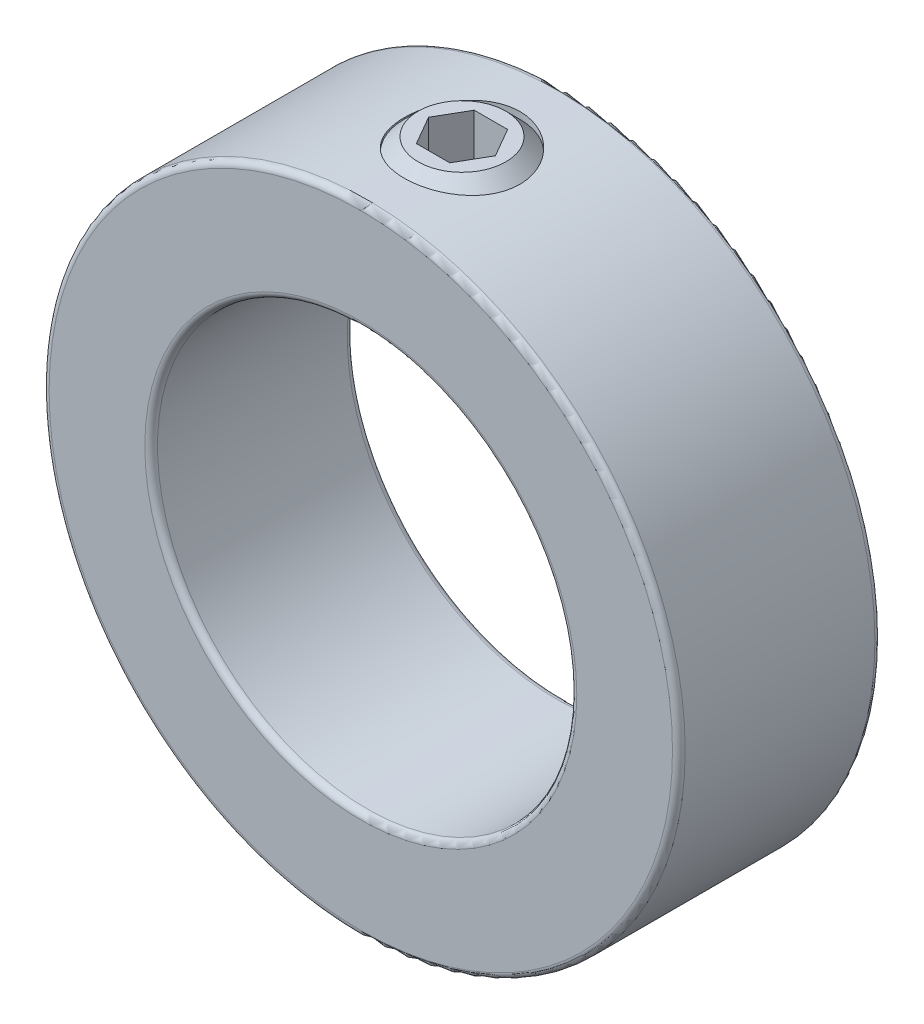
ISO-10303-21;
HEADER;
FILE_DESCRIPTION(('STEP AP214'),'2;1');
FILE_NAME('part.step','',(''),(''),'','','');
FILE_SCHEMA(('AUTOMOTIVE_DESIGN { 1 0 10303 214 1 1 1 1 }'));
ENDSEC;
DATA;
#1=APPLICATION_CONTEXT('core data for automotive mechanical design processes');
#2=APPLICATION_PROTOCOL_DEFINITION('international standard','automotive_design',2000,#1);
#3=PRODUCT_CONTEXT('',#1,'mechanical');
#4=PRODUCT('Part','Part','',(#3));
#5=PRODUCT_RELATED_PRODUCT_CATEGORY('part','',(#4));
#6=PRODUCT_DEFINITION_FORMATION('','',#4);
#7=PRODUCT_DEFINITION_CONTEXT('part definition',#1,'design');
#8=PRODUCT_DEFINITION('design','',#6,#7);
#9=PRODUCT_DEFINITION_SHAPE('','',#8);
#10=(LENGTH_UNIT() NAMED_UNIT(*) SI_UNIT(.MILLI.,.METRE.));
#11=(NAMED_UNIT(*) PLANE_ANGLE_UNIT() SI_UNIT($,.RADIAN.));
#12=(NAMED_UNIT(*) SI_UNIT($,.STERADIAN.) SOLID_ANGLE_UNIT());
#13=UNCERTAINTY_MEASURE_WITH_UNIT(LENGTH_MEASURE(1.E-05),#10,'distance_accuracy_value','');
#14=(GEOMETRIC_REPRESENTATION_CONTEXT(3) GLOBAL_UNCERTAINTY_ASSIGNED_CONTEXT((#13)) GLOBAL_UNIT_ASSIGNED_CONTEXT((#10,
#11,#12)) REPRESENTATION_CONTEXT('',''));
#15=CARTESIAN_POINT('',(0.,0.,0.));
#16=DIRECTION('',(0.,0.,1.));
#17=DIRECTION('',(1.,0.,0.));
#18=AXIS2_PLACEMENT_3D('',#15,#16,#17);
#19=CARTESIAN_POINT('',(0.,35.71875,0.));
#20=DIRECTION('',(0.,1.,0.));
#21=DIRECTION('',(-1.,0.,0.));
#22=AXIS2_PLACEMENT_3D('',#19,#20,#21);
#23=PLANE('',#22);
#24=CARTESIAN_POINT('',(0.,35.71875,0.));
#25=DIRECTION('',(0.,1.,0.));
#26=DIRECTION('',(-1.,0.,0.));
#27=AXIS2_PLACEMENT_3D('',#24,#25,#26);
#28=CIRCLE('',#27,4.81638526248807);
#29=CARTESIAN_POINT('',(-4.81638526248807,35.71875,0.));
#30=VERTEX_POINT('',#29);
#31=EDGE_CURVE('E12',#30,#30,#28,.T.);
#32=ORIENTED_EDGE('',*,*,#31,.T.);
#33=EDGE_LOOP('',(#32));
#34=FACE_BOUND('',#33,.T.);
#35=DIRECTION('',(1.,0.,0.));
#36=VECTOR('',#35,1.);
#37=CARTESIAN_POINT('',(-1.83308710467706,35.71875,-3.175));
#38=LINE('',#37,#36);
#39=CARTESIAN_POINT('',(-1.83308710467706,35.71875,-3.175));
#40=VERTEX_POINT('',#39);
#41=CARTESIAN_POINT('',(1.83308710467706,35.71875,-3.175));
#42=VERTEX_POINT('',#41);
#43=EDGE_CURVE('E115',#40,#42,#38,.T.);
#44=ORIENTED_EDGE('',*,*,#43,.T.);
#45=DIRECTION('',(0.5,0.,0.866025403784438));
#46=VECTOR('',#45,1.);
#47=CARTESIAN_POINT('',(1.83308710467706,35.71875,-3.175));
#48=LINE('',#47,#46);
#49=CARTESIAN_POINT('',(3.66617420935412,35.71875,0.));
#50=VERTEX_POINT('',#49);
#51=EDGE_CURVE('E61',#42,#50,#48,.T.);
#52=ORIENTED_EDGE('',*,*,#51,.T.);
#53=DIRECTION('',(-0.5,0.,0.866025403784439));
#54=VECTOR('',#53,1.);
#55=CARTESIAN_POINT('',(3.66617420935412,35.71875,0.));
#56=LINE('',#55,#54);
#57=CARTESIAN_POINT('',(1.83308710467706,35.71875,3.175));
#58=VERTEX_POINT('',#57);
#59=EDGE_CURVE('E119',#50,#58,#56,.T.);
#60=ORIENTED_EDGE('',*,*,#59,.T.);
#61=DIRECTION('',(-1.,0.,0.));
#62=VECTOR('',#61,1.);
#63=CARTESIAN_POINT('',(1.83308710467706,35.71875,3.175));
#64=LINE('',#63,#62);
#65=CARTESIAN_POINT('',(-1.83308710467706,35.71875,3.175));
#66=VERTEX_POINT('',#65);
#67=EDGE_CURVE('E182',#58,#66,#64,.T.);
#68=ORIENTED_EDGE('',*,*,#67,.T.);
#69=DIRECTION('',(-0.5,0.,-0.866025403784438));
#70=VECTOR('',#69,1.);
#71=CARTESIAN_POINT('',(-1.83308710467706,35.71875,3.175));
#72=LINE('',#71,#70);
#73=CARTESIAN_POINT('',(-3.66617420935412,35.71875,0.));
#74=VERTEX_POINT('',#73);
#75=EDGE_CURVE('E167',#66,#74,#72,.T.);
#76=ORIENTED_EDGE('',*,*,#75,.T.);
#77=DIRECTION('',(0.5,0.,-0.866025403784439));
#78=VECTOR('',#77,1.);
#79=CARTESIAN_POINT('',(-3.66617420935412,35.71875,0.));
#80=LINE('',#79,#78);
#81=EDGE_CURVE('E163',#74,#40,#80,.T.);
#82=ORIENTED_EDGE('',*,*,#81,.T.);
#83=EDGE_LOOP('',(#44,#52,#60,#68,#76,#82));
#84=FACE_BOUND('',#83,.T.);
#85=ADVANCED_FACE('F47',(#34,#84),#23,.T.);
#86=CARTESIAN_POINT('',(0.,35.71875,0.));
#87=DIRECTION('',(0.,-1.,0.));
#88=DIRECTION('',(1.,0.,0.));
#89=AXIS2_PLACEMENT_3D('',#86,#87,#88);
#90=CONICAL_SURFACE('',#89,4.81638526248807,0.785398163397449);
#91=CARTESIAN_POINT('',(0.,34.1851352624881,0.));
#92=DIRECTION('',(0.,1.,0.));
#93=DIRECTION('',(-1.,0.,0.));
#94=AXIS2_PLACEMENT_3D('',#91,#92,#93);
#95=CIRCLE('',#94,6.35);
#96=CARTESIAN_POINT('',(-6.35,34.1851352624881,0.));
#97=VERTEX_POINT('',#96);
#98=EDGE_CURVE('E54',#97,#97,#95,.T.);
#99=ORIENTED_EDGE('',*,*,#98,.T.);
#100=EDGE_LOOP('',(#99));
#101=FACE_BOUND('',#100,.T.);
#102=ORIENTED_EDGE('',*,*,#31,.F.);
#103=EDGE_LOOP('',(#102));
#104=FACE_BOUND('',#103,.T.);
#105=ADVANCED_FACE('F137',(#101,#104),#90,.T.);
#106=CARTESIAN_POINT('',(0.,23.01875,0.));
#107=DIRECTION('',(0.,1.,0.));
#108=DIRECTION('',(-1.,0.,0.));
#109=AXIS2_PLACEMENT_3D('',#106,#107,#108);
#110=CYLINDRICAL_SURFACE('',#109,6.35);
#111=CARTESIAN_POINT('',(0.,24.5523647375119,0.));
#112=DIRECTION('',(0.,1.,0.));
#113=DIRECTION('',(-1.,0.,0.));
#114=AXIS2_PLACEMENT_3D('',#111,#112,#113);
#115=CIRCLE('',#114,6.35);
#116=CARTESIAN_POINT('',(-6.35,24.5523647375119,0.));
#117=VERTEX_POINT('',#116);
#118=EDGE_CURVE('E132',#117,#117,#115,.T.);
#119=ORIENTED_EDGE('',*,*,#118,.T.);
#120=EDGE_LOOP('',(#119));
#121=FACE_BOUND('',#120,.T.);
#122=ORIENTED_EDGE('',*,*,#98,.F.);
#123=EDGE_LOOP('',(#122));
#124=FACE_BOUND('',#123,.T.);
#125=ADVANCED_FACE('F140',(#121,#124),#110,.T.);
#126=CARTESIAN_POINT('',(0.,24.5523647375119,0.));
#127=DIRECTION('',(0.,1.,0.));
#128=DIRECTION('',(-1.,0.,0.));
#129=AXIS2_PLACEMENT_3D('',#126,#127,#128);
#130=CONICAL_SURFACE('',#129,6.35,0.785398163397449);
#131=CARTESIAN_POINT('',(0.,23.01875,0.));
#132=DIRECTION('',(0.,1.,0.));
#133=DIRECTION('',(-1.,0.,0.));
#134=AXIS2_PLACEMENT_3D('',#131,#132,#133);
#135=CIRCLE('',#134,4.81638526248807);
#136=CARTESIAN_POINT('',(-4.81638526248807,23.01875,0.));
#137=VERTEX_POINT('',#136);
#138=EDGE_CURVE('E124',#137,#137,#135,.T.);
#139=ORIENTED_EDGE('',*,*,#138,.T.);
#140=EDGE_LOOP('',(#139));
#141=FACE_BOUND('',#140,.T.);
#142=ORIENTED_EDGE('',*,*,#118,.F.);
#143=EDGE_LOOP('',(#142));
#144=FACE_BOUND('',#143,.T.);
#145=ADVANCED_FACE('F142',(#141,#144),#130,.T.);
#146=CARTESIAN_POINT('',(-4.81638526248807,23.01875,0.));
#147=DIRECTION('',(0.,-1.,0.));
#148=DIRECTION('',(1.,0.,0.));
#149=AXIS2_PLACEMENT_3D('',#146,#147,#148);
#150=PLANE('',#149);
#151=CARTESIAN_POINT('',(0.,23.01875,0.));
#152=DIRECTION('',(0.,1.,0.));
#153=DIRECTION('',(-1.,0.,0.));
#154=AXIS2_PLACEMENT_3D('',#151,#152,#153);
#155=CIRCLE('',#154,1.84033768501432);
#156=CARTESIAN_POINT('',(-1.84033768501432,23.01875,0.));
#157=VERTEX_POINT('',#156);
#158=EDGE_CURVE('E120',#157,#157,#155,.T.);
#159=ORIENTED_EDGE('',*,*,#158,.T.);
#160=EDGE_LOOP('',(#159));
#161=FACE_BOUND('',#160,.T.);
#162=ORIENTED_EDGE('',*,*,#138,.F.);
#163=EDGE_LOOP('',(#162));
#164=FACE_BOUND('',#163,.T.);
#165=ADVANCED_FACE('F149',(#161,#164),#150,.T.);
#166=CARTESIAN_POINT('',(0.,23.01875,0.));
#167=DIRECTION('',(0.,-1.,0.));
#168=DIRECTION('',(1.,0.,0.));
#169=AXIS2_PLACEMENT_3D('',#166,#167,#168);
#170=CONICAL_SURFACE('',#169,1.84033768501432,0.785398163397448);
#171=CARTESIAN_POINT('',(0.,24.8590876850143,0.));
#172=VERTEX_POINT('',#171);
#173=VERTEX_LOOP('',#172);
#174=FACE_BOUND('',#173,.T.);
#175=ORIENTED_EDGE('',*,*,#158,.F.);
#176=EDGE_LOOP('',(#175));
#177=FACE_BOUND('',#176,.T.);
#178=ADVANCED_FACE('F216',(#174,#177),#170,.F.);
#179=CARTESIAN_POINT('',(1.83308710467706,29.36875,-3.175));
#180=DIRECTION('',(-0.866025403784439,0.,0.5));
#181=DIRECTION('',(0.5,0.,0.866025403784439));
#182=AXIS2_PLACEMENT_3D('',#179,#180,#181);
#183=PLANE('',#182);
#184=ORIENTED_EDGE('',*,*,#51,.F.);
#185=DIRECTION('',(0.,1.,0.));
#186=VECTOR('',#185,1.);
#187=CARTESIAN_POINT('',(1.83308710467706,29.36875,-3.175));
#188=LINE('',#187,#186);
#189=CARTESIAN_POINT('',(1.83308710467706,29.36875,-3.175));
#190=VERTEX_POINT('',#189);
#191=EDGE_CURVE('E114',#190,#42,#188,.T.);
#192=ORIENTED_EDGE('',*,*,#191,.F.);
#193=DIRECTION('',(0.5,0.,0.866025403784438));
#194=VECTOR('',#193,1.);
#195=CARTESIAN_POINT('',(1.83308710467706,29.36875,-3.175));
#196=LINE('',#195,#194);
#197=CARTESIAN_POINT('',(3.66617420935412,29.36875,0.));
#198=VERTEX_POINT('',#197);
#199=EDGE_CURVE('E105',#190,#198,#196,.T.);
#200=ORIENTED_EDGE('',*,*,#199,.T.);
#201=DIRECTION('',(0.,1.,0.));
#202=VECTOR('',#201,1.);
#203=CARTESIAN_POINT('',(3.66617420935412,29.36875,0.));
#204=LINE('',#203,#202);
#205=EDGE_CURVE('E113',#198,#50,#204,.T.);
#206=ORIENTED_EDGE('',*,*,#205,.T.);
#207=EDGE_LOOP('',(#184,#192,#200,#206));
#208=FACE_BOUND('',#207,.T.);
#209=ADVANCED_FACE('F112',(#208),#183,.T.);
#210=CARTESIAN_POINT('',(3.66617420935412,29.36875,0.));
#211=DIRECTION('',(-0.866025403784439,0.,-0.5));
#212=DIRECTION('',(-0.5,0.,0.866025403784439));
#213=AXIS2_PLACEMENT_3D('',#210,#211,#212);
#214=PLANE('',#213);
#215=ORIENTED_EDGE('',*,*,#59,.F.);
#216=ORIENTED_EDGE('',*,*,#205,.F.);
#217=DIRECTION('',(-0.5,0.,0.866025403784439));
#218=VECTOR('',#217,1.);
#219=CARTESIAN_POINT('',(3.66617420935412,29.36875,0.));
#220=LINE('',#219,#218);
#221=CARTESIAN_POINT('',(1.83308710467706,29.36875,3.175));
#222=VERTEX_POINT('',#221);
#223=EDGE_CURVE('E101',#198,#222,#220,.T.);
#224=ORIENTED_EDGE('',*,*,#223,.T.);
#225=DIRECTION('',(0.,1.,0.));
#226=VECTOR('',#225,1.);
#227=CARTESIAN_POINT('',(1.83308710467706,29.36875,3.175));
#228=LINE('',#227,#226);
#229=EDGE_CURVE('E121',#222,#58,#228,.T.);
#230=ORIENTED_EDGE('',*,*,#229,.T.);
#231=EDGE_LOOP('',(#215,#216,#224,#230));
#232=FACE_BOUND('',#231,.T.);
#233=ADVANCED_FACE('F117',(#232),#214,.T.);
#234=CARTESIAN_POINT('',(1.83308710467706,29.36875,3.175));
#235=DIRECTION('',(0.,0.,-1.));
#236=DIRECTION('',(-1.,0.,0.));
#237=AXIS2_PLACEMENT_3D('',#234,#235,#236);
#238=PLANE('',#237);
#239=ORIENTED_EDGE('',*,*,#67,.F.);
#240=ORIENTED_EDGE('',*,*,#229,.F.);
#241=DIRECTION('',(-1.,0.,0.));
#242=VECTOR('',#241,1.);
#243=CARTESIAN_POINT('',(1.83308710467706,29.36875,3.175));
#244=LINE('',#243,#242);
#245=CARTESIAN_POINT('',(-1.83308710467706,29.36875,3.175));
#246=VERTEX_POINT('',#245);
#247=EDGE_CURVE('E107',#222,#246,#244,.T.);
#248=ORIENTED_EDGE('',*,*,#247,.T.);
#249=DIRECTION('',(0.,1.,0.));
#250=VECTOR('',#249,1.);
#251=CARTESIAN_POINT('',(-1.83308710467706,29.36875,3.175));
#252=LINE('',#251,#250);
#253=EDGE_CURVE('E126',#246,#66,#252,.T.);
#254=ORIENTED_EDGE('',*,*,#253,.T.);
#255=EDGE_LOOP('',(#239,#240,#248,#254));
#256=FACE_BOUND('',#255,.T.);
#257=ADVANCED_FACE('F180',(#256),#238,.T.);
#258=CARTESIAN_POINT('',(-1.83308710467706,29.36875,3.175));
#259=DIRECTION('',(0.866025403784438,0.,-0.5));
#260=DIRECTION('',(-0.5,0.,-0.866025403784439));
#261=AXIS2_PLACEMENT_3D('',#258,#259,#260);
#262=PLANE('',#261);
#263=ORIENTED_EDGE('',*,*,#75,.F.);
#264=ORIENTED_EDGE('',*,*,#253,.F.);
#265=DIRECTION('',(-0.5,0.,-0.866025403784438));
#266=VECTOR('',#265,1.);
#267=CARTESIAN_POINT('',(-1.83308710467706,29.36875,3.175));
#268=LINE('',#267,#266);
#269=CARTESIAN_POINT('',(-3.66617420935412,29.36875,0.));
#270=VERTEX_POINT('',#269);
#271=EDGE_CURVE('E193',#246,#270,#268,.T.);
#272=ORIENTED_EDGE('',*,*,#271,.T.);
#273=DIRECTION('',(0.,1.,0.));
#274=VECTOR('',#273,1.);
#275=CARTESIAN_POINT('',(-3.66617420935412,29.36875,0.));
#276=LINE('',#275,#274);
#277=EDGE_CURVE('E175',#270,#74,#276,.T.);
#278=ORIENTED_EDGE('',*,*,#277,.T.);
#279=EDGE_LOOP('',(#263,#264,#272,#278));
#280=FACE_BOUND('',#279,.T.);
#281=ADVANCED_FACE('F184',(#280),#262,.T.);
#282=CARTESIAN_POINT('',(-3.66617420935412,29.36875,0.));
#283=DIRECTION('',(0.866025403784439,0.,0.5));
#284=DIRECTION('',(0.5,0.,-0.866025403784439));
#285=AXIS2_PLACEMENT_3D('',#282,#283,#284);
#286=PLANE('',#285);
#287=ORIENTED_EDGE('',*,*,#81,.F.);
#288=ORIENTED_EDGE('',*,*,#277,.F.);
#289=DIRECTION('',(0.5,0.,-0.866025403784439));
#290=VECTOR('',#289,1.);
#291=CARTESIAN_POINT('',(-3.66617420935412,29.36875,0.));
#292=LINE('',#291,#290);
#293=CARTESIAN_POINT('',(-1.83308710467706,29.36875,-3.175));
#294=VERTEX_POINT('',#293);
#295=EDGE_CURVE('E191',#270,#294,#292,.T.);
#296=ORIENTED_EDGE('',*,*,#295,.T.);
#297=DIRECTION('',(0.,1.,0.));
#298=VECTOR('',#297,1.);
#299=CARTESIAN_POINT('',(-1.83308710467706,29.36875,-3.175));
#300=LINE('',#299,#298);
#301=EDGE_CURVE('E172',#294,#40,#300,.T.);
#302=ORIENTED_EDGE('',*,*,#301,.T.);
#303=EDGE_LOOP('',(#287,#288,#296,#302));
#304=FACE_BOUND('',#303,.T.);
#305=ADVANCED_FACE('F197',(#304),#286,.T.);
#306=CARTESIAN_POINT('',(-1.83308710467706,29.36875,-3.175));
#307=DIRECTION('',(0.,0.,1.));
#308=DIRECTION('',(1.,0.,0.));
#309=AXIS2_PLACEMENT_3D('',#306,#307,#308);
#310=PLANE('',#309);
#311=ORIENTED_EDGE('',*,*,#43,.F.);
#312=ORIENTED_EDGE('',*,*,#301,.F.);
#313=DIRECTION('',(1.,0.,0.));
#314=VECTOR('',#313,1.);
#315=CARTESIAN_POINT('',(-1.83308710467706,29.36875,-3.175));
#316=LINE('',#315,#314);
#317=EDGE_CURVE('E173',#294,#190,#316,.T.);
#318=ORIENTED_EDGE('',*,*,#317,.T.);
#319=ORIENTED_EDGE('',*,*,#191,.T.);
#320=EDGE_LOOP('',(#311,#312,#318,#319));
#321=FACE_BOUND('',#320,.T.);
#322=ADVANCED_FACE('F198',(#321),#310,.T.);
#323=CARTESIAN_POINT('',(1.83308710467706,29.36875,-3.175));
#324=DIRECTION('',(0.,1.,0.));
#325=DIRECTION('',(0.,0.,1.));
#326=AXIS2_PLACEMENT_3D('',#323,#324,#325);
#327=PLANE('',#326);
#328=ORIENTED_EDGE('',*,*,#199,.F.);
#329=ORIENTED_EDGE('',*,*,#317,.F.);
#330=ORIENTED_EDGE('',*,*,#295,.F.);
#331=ORIENTED_EDGE('',*,*,#271,.F.);
#332=ORIENTED_EDGE('',*,*,#247,.F.);
#333=ORIENTED_EDGE('',*,*,#223,.F.);
#334=EDGE_LOOP('',(#328,#329,#330,#331,#332,#333));
#335=FACE_BOUND('',#334,.T.);
#336=ADVANCED_FACE('F103',(#335),#327,.T.);
#337=CLOSED_SHELL('',(#85,#105,#125,#145,#165,#178,#209,#233,#257,#281,#305,#322,#336));
#338=MANIFOLD_SOLID_BREP('B2',#337);
#339=CARTESIAN_POINT('',(0.,0.,11.1125));
#340=DIRECTION('',(0.,0.,1.));
#341=DIRECTION('',(1.,0.,0.));
#342=AXIS2_PLACEMENT_3D('',#339,#340,#341);
#343=PLANE('',#342);
#344=CARTESIAN_POINT('',(0.,0.,11.1125));
#345=DIRECTION('',(0.,0.,1.));
#346=DIRECTION('',(1.,0.,0.));
#347=AXIS2_PLACEMENT_3D('',#344,#345,#346);
#348=CIRCLE('',#347,23.71725);
#349=CARTESIAN_POINT('',(23.71725,0.,11.1125));
#350=VERTEX_POINT('',#349);
#351=EDGE_CURVE('E313',#350,#350,#348,.F.);
#352=ORIENTED_EDGE('',*,*,#351,.T.);
#353=EDGE_LOOP('',(#352));
#354=FACE_BOUND('',#353,.T.);
#355=CARTESIAN_POINT('',(0.,0.,11.1125));
#356=DIRECTION('',(0.,0.,1.));
#357=DIRECTION('',(1.,0.,0.));
#358=AXIS2_PLACEMENT_3D('',#355,#356,#357);
#359=CIRCLE('',#358,34.2265);
#360=CARTESIAN_POINT('',(34.2265,0.,11.1125));
#361=VERTEX_POINT('',#360);
#362=EDGE_CURVE('E317',#361,#361,#359,.T.);
#363=ORIENTED_EDGE('',*,*,#362,.T.);
#364=EDGE_LOOP('',(#363));
#365=FACE_BOUND('',#364,.T.);
#366=ADVANCED_FACE('F302',(#354,#365),#343,.T.);
#367=CARTESIAN_POINT('',(0.,0.,-11.1125));
#368=DIRECTION('',(0.,0.,1.));
#369=DIRECTION('',(1.,0.,0.));
#370=AXIS2_PLACEMENT_3D('',#367,#368,#369);
#371=PLANE('',#370);
#372=CARTESIAN_POINT('',(0.,0.,-11.1125));
#373=DIRECTION('',(0.,0.,1.));
#374=DIRECTION('',(1.,0.,0.));
#375=AXIS2_PLACEMENT_3D('',#372,#373,#374);
#376=CIRCLE('',#375,23.71725);
#377=CARTESIAN_POINT('',(23.71725,0.,-11.1125));
#378=VERTEX_POINT('',#377);
#379=EDGE_CURVE('E328',#378,#378,#376,.T.);
#380=ORIENTED_EDGE('',*,*,#379,.T.);
#381=EDGE_LOOP('',(#380));
#382=FACE_BOUND('',#381,.T.);
#383=CARTESIAN_POINT('',(0.,0.,-11.1125));
#384=DIRECTION('',(0.,0.,1.));
#385=DIRECTION('',(1.,0.,0.));
#386=AXIS2_PLACEMENT_3D('',#383,#384,#385);
#387=CIRCLE('',#386,34.2265);
#388=CARTESIAN_POINT('',(34.2265,0.,-11.1125));
#389=VERTEX_POINT('',#388);
#390=EDGE_CURVE('E331',#389,#389,#387,.F.);
#391=ORIENTED_EDGE('',*,*,#390,.T.);
#392=EDGE_LOOP('',(#391));
#393=FACE_BOUND('',#392,.T.);
#394=ADVANCED_FACE('F365',(#382,#393),#371,.F.);
#395=CARTESIAN_POINT('',(0.,0.,11.1125));
#396=DIRECTION('',(0.,0.,-1.));
#397=DIRECTION('',(-1.,0.,0.));
#398=AXIS2_PLACEMENT_3D('',#395,#396,#397);
#399=CYLINDRICAL_SURFACE('',#398,34.925);
#400=CARTESIAN_POINT('',(0.,0.,-10.414));
#401=DIRECTION('',(0.,0.,1.));
#402=DIRECTION('',(1.,0.,0.));
#403=AXIS2_PLACEMENT_3D('',#400,#401,#402);
#404=CIRCLE('',#403,34.925);
#405=CARTESIAN_POINT('',(34.925,0.,-10.414));
#406=VERTEX_POINT('',#405);
#407=EDGE_CURVE('E46',#406,#406,#404,.T.);
#408=ORIENTED_EDGE('',*,*,#407,.T.);
#409=EDGE_LOOP('',(#408));
#410=FACE_BOUND('',#409,.T.);
#411=CARTESIAN_POINT('',(0.,0.,10.414));
#412=DIRECTION('',(0.,0.,1.));
#413=DIRECTION('',(1.,0.,0.));
#414=AXIS2_PLACEMENT_3D('',#411,#412,#413);
#415=CIRCLE('',#414,34.925);
#416=CARTESIAN_POINT('',(34.925,0.,10.414));
#417=VERTEX_POINT('',#416);
#418=EDGE_CURVE('E309',#417,#417,#415,.F.);
#419=ORIENTED_EDGE('',*,*,#418,.T.);
#420=EDGE_LOOP('',(#419));
#421=FACE_BOUND('',#420,.T.);
#422=CARTESIAN_POINT('',(0.,34.925,-6.35));
#423=CARTESIAN_POINT('',(0.176839741694861,34.9250014331245,-6.35000305731179));
#424=CARTESIAN_POINT('',(0.353639480462466,34.9236544612294,-6.3426107162696));
#425=CARTESIAN_POINT('',(0.706019623561976,34.9183072993934,-6.31310430020068));
#426=CARTESIAN_POINT('',(0.881599795734451,34.9143066175557,-6.29098749581627));
#427=CARTESIAN_POINT('',(1.2303236591514,34.9037589484303,-6.23218220434826));
#428=CARTESIAN_POINT('',(1.40346587291845,34.8972104805747,-6.19548524418936));
#429=CARTESIAN_POINT('',(1.74604960482289,34.8817480403076,-6.10778880211143));
#430=CARTESIAN_POINT('',(1.91548973941122,34.8728331993593,-6.05678406837708));
#431=CARTESIAN_POINT('',(2.24920207012183,34.8528997990486,-5.94093830623187));
#432=CARTESIAN_POINT('',(2.41348051385061,34.8418839067704,-5.8761148072771));
#433=CARTESIAN_POINT('',(2.73602049680393,34.8180410095526,-5.73304706366161));
#434=CARTESIAN_POINT('',(2.89427979169137,34.8052133373039,-5.65479787180088));
#435=CARTESIAN_POINT('',(3.20356790738937,34.7781090427405,-5.48550075280868));
#436=CARTESIAN_POINT('',(3.35460012309866,34.7638331107727,-5.39445891569658));
#437=CARTESIAN_POINT('',(3.64855564851637,34.7342122519968,-5.20015335862663));
#438=CARTESIAN_POINT('',(3.79147590845625,34.7188669279077,-5.09688508646235));
#439=CARTESIAN_POINT('',(4.06954442575484,34.6873781889273,-4.87780098612066));
#440=CARTESIAN_POINT('',(4.20460334335118,34.6712284525315,-4.76187265977729));
#441=CARTESIAN_POINT('',(4.46455219950956,34.638714861404,-4.51906167779578));
#442=CARTESIAN_POINT('',(4.58943835320197,34.6223509295834,-4.39217498084333));
#443=CARTESIAN_POINT('',(4.82809873249207,34.5898770024694,-4.12838810164481));
#444=CARTESIAN_POINT('',(4.94187625273498,34.5737669330803,-3.99149090954928));
#445=CARTESIAN_POINT('',(5.15761529018478,34.5422425768814,-3.70852666051952));
#446=CARTESIAN_POINT('',(5.25957243404183,34.5268285488751,-3.56245624025789));
#447=CARTESIAN_POINT('',(5.45158031410517,34.4970347691939,-3.26112114542934));
#448=CARTESIAN_POINT('',(5.54154190033436,34.4826630886285,-3.10579883538527));
#449=CARTESIAN_POINT('',(5.70807680795974,34.4554872993976,-2.78793333773589));
#450=CARTESIAN_POINT('',(5.784645118829,34.4426837779272,-2.62538747614171));
#451=CARTESIAN_POINT('',(5.92374725069468,34.4190330776195,-2.29432269320596));
#452=CARTESIAN_POINT('',(5.98628714881185,34.4081850520612,-2.12580639504015));
#453=CARTESIAN_POINT('',(6.09691048603386,34.3887540868443,-1.78396789200117));
#454=CARTESIAN_POINT('',(6.14498866125452,34.3801719720872,-1.61064396222198));
#455=CARTESIAN_POINT('',(6.26595825979825,34.3584121810055,-1.08913985609858));
#456=CARTESIAN_POINT('',(6.31726758276105,34.3489246550815,-0.7354082591231));
#457=CARTESIAN_POINT('',(6.34927692143047,34.3430083972679,-0.202610799573718));
#458=CARTESIAN_POINT('',(6.35244632573767,34.3424236180009,-0.0245714944119746));
#459=CARTESIAN_POINT('',(6.34385258246242,34.3440124085966,0.331155957191607));
#460=CARTESIAN_POINT('',(6.33208918394321,34.3461860248124,0.508844097682079));
#461=CARTESIAN_POINT('',(6.27491328196357,34.3567008237713,1.0349534553633));
#462=CARTESIAN_POINT('',(6.20789183949449,34.3689861437452,1.38119219981656));
#463=CARTESIAN_POINT('',(6.01778351345258,34.4027766835036,2.05724671619926));
#464=CARTESIAN_POINT('',(5.89469437687157,34.4242822737907,2.38706182757526));
#465=CARTESIAN_POINT('',(5.59521700271177,34.4742259552534,3.02329303217931));
#466=CARTESIAN_POINT('',(5.41853097416335,34.5027026033381,3.32956608909996));
#467=CARTESIAN_POINT('',(5.01708740225125,34.5633554074558,3.90838038153373));
#468=CARTESIAN_POINT('',(4.79232526244375,34.5955319170876,4.18091838778206));
#469=CARTESIAN_POINT('',(4.29715295340674,34.6605428706987,4.68877226199298));
#470=CARTESIAN_POINT('',(4.02611645407305,34.6933800043814,4.9234775790697));
#471=CARTESIAN_POINT('',(3.44819141081381,34.7555740696689,5.34417658052166));
#472=CARTESIAN_POINT('',(3.14130254698116,34.7849309702153,5.53016983019593));
#473=CARTESIAN_POINT('',(2.49976512690628,34.8369108277633,5.84824638733464));
#474=CARTESIAN_POINT('',(2.16508577856824,34.8595261842707,5.98026890936269));
#475=CARTESIAN_POINT('',(1.4777987151065,34.8954155231852,6.18605315491268));
#476=CARTESIAN_POINT('',(1.12519279285583,34.9086904377861,6.25982069248131));
#477=CARTESIAN_POINT('',(0.417317713962533,34.9242758900216,6.34615749433072));
#478=CARTESIAN_POINT('',(0.0621538438158903,34.92673638707,6.35956382863739));
#479=CARTESIAN_POINT('',(-0.645341739102595,34.9208290098694,6.32703902160397));
#480=CARTESIAN_POINT('',(-0.997673581641486,34.912461634646,6.2811106148323));
#481=CARTESIAN_POINT('',(-1.68686826507451,34.8859319007735,6.13191647102301));
#482=CARTESIAN_POINT('',(-2.02382524588064,34.8678414836824,6.02907169887369));
#483=CARTESIAN_POINT('',(-2.67571453973151,34.8238856138639,5.76941658589534));
#484=CARTESIAN_POINT('',(-2.99064542649256,34.7980196582107,5.61260275422491));
#485=CARTESIAN_POINT('',(-3.59313213218262,34.7410081254346,5.24759459425773));
#486=CARTESIAN_POINT('',(-3.88037109559589,34.7098107048186,5.03888557808504));
#487=CARTESIAN_POINT('',(-4.41605182872407,34.6457360576941,4.57669379391345));
#488=CARTESIAN_POINT('',(-4.66449020274636,34.6128586844957,4.32320711126136));
#489=CARTESIAN_POINT('',(-5.11865924731663,34.548637090716,3.77494130954496));
#490=CARTESIAN_POINT('',(-5.32382006216004,34.5173170364634,3.47968765099847));
#491=CARTESIAN_POINT('',(-5.68167682687898,34.4602266885237,2.8582172268504));
#492=CARTESIAN_POINT('',(-5.83437465204688,34.4344561964794,2.53200156851924));
#493=CARTESIAN_POINT('',(-6.02023934559,34.4022697818922,2.02763386356904));
#494=CARTESIAN_POINT('',(-6.07493692627656,34.3926308519063,1.85732626628343));
#495=CARTESIAN_POINT('',(-6.16979786402324,34.375741019884,1.51260992843523));
#496=CARTESIAN_POINT('',(-6.20996649924436,34.3684892507121,1.33820270178205));
#497=CARTESIAN_POINT('',(-6.27545025466904,34.356592549749,0.986527064240327));
#498=CARTESIAN_POINT('',(-6.30076383045381,34.3519478890102,0.8092583578235));
#499=CARTESIAN_POINT('',(-6.3363355141506,34.3454044628546,0.453167939066219));
#500=CARTESIAN_POINT('',(-6.34659414139175,34.3435056027199,0.274346280509809));
#501=CARTESIAN_POINT('',(-6.35193216337111,34.3425186652681,-0.0808605576484265));
#502=CARTESIAN_POINT('',(-6.34723562057506,34.3433890974809,-0.257242307620375));
#503=CARTESIAN_POINT('',(-6.32318981966519,34.3478244539837,-0.60896734561323));
#504=CARTESIAN_POINT('',(-6.30384082548026,34.3513893297397,-0.784310652281877));
#505=CARTESIAN_POINT('',(-6.2506371475179,34.3611101379996,-1.13273990176111));
#506=CARTESIAN_POINT('',(-6.21677993260506,34.3672665226203,-1.30582544524541));
#507=CARTESIAN_POINT('',(-6.13483598036163,34.3819886322155,-1.64842307888578));
#508=CARTESIAN_POINT('',(-6.08675434448703,34.3905534933578,-1.81793642686816));
#509=CARTESIAN_POINT('',(-5.97679348521777,34.4098339603046,-2.15205271822897));
#510=CARTESIAN_POINT('',(-5.91493241535857,34.4205467345312,-2.31666180211115));
#511=CARTESIAN_POINT('',(-5.77785770740762,34.4438211138053,-2.64001643522501));
#512=CARTESIAN_POINT('',(-5.70264882626338,34.456382059922,-2.79876404912285));
#513=CARTESIAN_POINT('',(-5.53937057447499,34.4830079863136,-3.10945055418431));
#514=CARTESIAN_POINT('',(-5.45129603023175,34.4970735710285,-3.26138667400508));
#515=CARTESIAN_POINT('',(-5.26295911926467,34.5263082397566,-3.55731823196054));
#516=CARTESIAN_POINT('',(-5.16270099280101,34.5414769391181,-3.70131640752484));
#517=CARTESIAN_POINT('',(-4.94912217290632,34.5727295205263,-3.9825002661863));
#518=CARTESIAN_POINT('',(-4.8356335016895,34.5888234671015,-4.11955727112601));
#519=CARTESIAN_POINT('',(-4.59761885958314,34.6212643084185,-4.3836038994076));
#520=CARTESIAN_POINT('',(-4.47309681711562,34.6376111114334,-4.51059707570108));
#521=CARTESIAN_POINT('',(-4.21375138654904,34.6701169446119,-4.75377922802669));
#522=CARTESIAN_POINT('',(-4.07892192091432,34.6862758574202,-4.86996173888867));
#523=CARTESIAN_POINT('',(-3.799993241112,34.7179401231397,-5.09059526730403));
#524=CARTESIAN_POINT('',(-3.65589746326752,34.733445714838,-5.19505059476118));
#525=CARTESIAN_POINT('',(-3.35806410421238,34.7635099360446,-5.3924111192215));
#526=CARTESIAN_POINT('',(-3.20425291538458,34.7780590455143,-5.48520673952219));
#527=CARTESIAN_POINT('',(-2.88927693187882,34.8056415890842,-5.65745425341251));
#528=CARTESIAN_POINT('',(-2.72811487254189,34.8186755806725,-5.73691105983314));
#529=CARTESIAN_POINT('',(-2.39962001264307,34.8428549447837,-5.88188125997705));
#530=CARTESIAN_POINT('',(-2.23229134437548,34.8540015550108,-5.94740379876707));
#531=CARTESIAN_POINT('',(-1.8926198862527,34.8740961340115,-6.06405353721967));
#532=CARTESIAN_POINT('',(-1.72027813309499,34.8830445538026,-6.11518369017839));
#533=CARTESIAN_POINT('',(-1.29374114302783,34.9019408958789,-6.22224368651496));
#534=CARTESIAN_POINT('',(-1.03741207205598,34.9105457565779,-6.27009183124623));
#535=CARTESIAN_POINT('',(-0.520693047163983,34.9220741888342,-6.33396737353737));
#536=CARTESIAN_POINT('',(-0.260303186366682,34.9249978904805,-6.34999549972199));
#537=CARTESIAN_POINT('',(0.,34.925,-6.35));
#538=B_SPLINE_CURVE_WITH_KNOTS('',3,(#422,#423,#424,#425,#426,#427,#428,#429,#430,#431,#432,
#433,#434,#435,#436,#437,#438,#439,#440,#441,#442,#443,#444,#445,#446,#447,#448,#449,#450,#451,
#452,#453,#454,#455,#456,#457,#458,#459,#460,#461,#462,#463,#464,#465,#466,#467,#468,#469,#470,
#471,#472,#473,#474,#475,#476,#477,#478,#479,#480,#481,#482,#483,#484,#485,#486,#487,#488,#489,
#490,#491,#492,#493,#494,#495,#496,#497,#498,#499,#500,#501,#502,#503,#504,#505,#506,#507,#508,
#509,#510,#511,#512,#513,#514,#515,#516,#517,#518,#519,#520,#521,#522,#523,#524,#525,#526,#527,
#528,#529,#530,#531,#532,#533,#534,#535,#536,#537),.UNSPECIFIED.,.T.,.F.,(4,2,2,2,2,2,2,2,2,2,2,
2,2,2,2,2,2,2,2,2,2,2,2,2,2,2,2,2,2,2,2,2,2,2,2,2,2,2,2,2,2,2,2,2,2,2,2,2,2,2,2,2,2,2,2,2,2,4),
(0.,0.530290890232027,1.06068010368323,1.59137799809458,2.12227094609131,2.65249440824581,
3.18291367238608,3.71308127723941,4.24344690116475,4.7789824034779,5.3147162551162,
5.85029073079729,6.38606273231553,6.92561763855931,7.46537396671511,8.00489601843436,
8.54461421237957,9.6111107686631,10.1447970088978,10.6784922175272,11.7317265304947,
12.7850031700629,13.8442425991653,14.9035833449586,15.9786015505382,17.0536293491313,
18.1298646020148,19.2059924293599,20.2671499506751,21.3282585680216,22.3816219183212,
23.4350534153653,24.4993813197711,25.5638023183207,26.6414674386508,27.7190940337748,
28.25596393791,28.7926386084205,29.3293690648859,29.8660810060897,30.3947898258173,
30.9234891223456,31.4522806944686,31.9808828498547,32.5087926813319,33.0365147505644,
33.564449616978,34.0922012692697,34.6275871289528,35.1627831251413,35.698297158065,
36.2336137333529,36.7736349578929,37.3134568482547,37.8529233523541,38.3922790778984,
39.1728704088701,39.9534438654114),.UNSPECIFIED.);
#539=CARTESIAN_POINT('',(0.,34.925,-6.35));
#540=VERTEX_POINT('',#539);
#541=EDGE_CURVE('E334',#540,#540,#538,.T.);
#542=ORIENTED_EDGE('',*,*,#541,.T.);
#543=EDGE_LOOP('',(#542));
#544=FACE_BOUND('',#543,.T.);
#545=ADVANCED_FACE('F361',(#410,#421,#544),#399,.T.);
#546=CARTESIAN_POINT('',(0.,0.,11.1125));
#547=DIRECTION('',(0.,0.,-1.));
#548=DIRECTION('',(-1.,0.,0.));
#549=AXIS2_PLACEMENT_3D('',#546,#547,#548);
#550=CYLINDRICAL_SURFACE('',#549,23.01875);
#551=CARTESIAN_POINT('',(0.,0.,-10.414));
#552=DIRECTION('',(0.,0.,1.));
#553=DIRECTION('',(1.,0.,0.));
#554=AXIS2_PLACEMENT_3D('',#551,#552,#553);
#555=CIRCLE('',#554,23.01875);
#556=CARTESIAN_POINT('',(23.01875,0.,-10.414));
#557=VERTEX_POINT('',#556);
#558=EDGE_CURVE('E322',#557,#557,#555,.F.);
#559=ORIENTED_EDGE('',*,*,#558,.T.);
#560=EDGE_LOOP('',(#559));
#561=FACE_BOUND('',#560,.T.);
#562=CARTESIAN_POINT('',(0.,0.,10.414));
#563=DIRECTION('',(0.,0.,1.));
#564=DIRECTION('',(1.,0.,0.));
#565=AXIS2_PLACEMENT_3D('',#562,#563,#564);
#566=CIRCLE('',#565,23.01875);
#567=CARTESIAN_POINT('',(23.01875,0.,10.414));
#568=VERTEX_POINT('',#567);
#569=EDGE_CURVE('E325',#568,#568,#566,.T.);
#570=ORIENTED_EDGE('',*,*,#569,.T.);
#571=EDGE_LOOP('',(#570));
#572=FACE_BOUND('',#571,.T.);
#573=CARTESIAN_POINT('',(0.,23.01875,-6.35));
#574=CARTESIAN_POINT('',(0.174857665897487,23.0187541988321,-6.35000646007319));
#575=CARTESIAN_POINT('',(0.349649887553577,23.0167549498529,-6.34277698349283));
#576=CARTESIAN_POINT('',(0.698001866146378,23.0088230698017,-6.31393766913294));
#577=CARTESIAN_POINT('',(0.87156152278459,23.002890122254,-6.29232667432423));
#578=CARTESIAN_POINT('',(1.216164253323,22.9872480310942,-6.2348997182241));
#579=CARTESIAN_POINT('',(1.38720684564978,22.9775381743736,-6.19908107439794));
#580=CARTESIAN_POINT('',(1.72560258836023,22.9546055125855,-6.11353105421875));
#581=CARTESIAN_POINT('',(1.89295435222581,22.9413814108858,-6.06379454230416));
#582=CARTESIAN_POINT('',(2.2224597526516,22.9118057527558,-5.95092005413119));
#583=CARTESIAN_POINT('',(2.38462191921323,22.8954596725888,-5.88780552328349));
#584=CARTESIAN_POINT('',(2.70303242637644,22.8600556181237,-5.74859311492694));
#585=CARTESIAN_POINT('',(2.85927855413774,22.8409966415329,-5.6724904368073));
#586=CARTESIAN_POINT('',(3.16475017717558,22.8006782193683,-5.50789765372248));
#587=CARTESIAN_POINT('',(3.3139779050357,22.7794194805296,-5.41941152408625));
#588=CARTESIAN_POINT('',(3.6045549025847,22.7352518911618,-5.23065438276111));
#589=CARTESIAN_POINT('',(3.74590112652961,22.7123424104492,-5.13037886105387));
#590=CARTESIAN_POINT('',(4.16273047534933,22.6410007548868,-4.80823065359788));
#591=CARTESIAN_POINT('',(4.4244714026138,22.590854345426,-4.56855335339734));
#592=CARTESIAN_POINT('',(4.90454189935171,22.4915248858881,-4.04884247211309));
#593=CARTESIAN_POINT('',(5.12286545481739,22.4423419701198,-3.76880330951205));
#594=CARTESIAN_POINT('',(5.41512900522717,22.3729636566832,-3.32137421634736));
#595=CARTESIAN_POINT('',(5.50738651412255,22.3503762152637,-3.16604901143855));
#596=CARTESIAN_POINT('',(5.67843964677215,22.3075312519365,-2.84787592423833));
#597=CARTESIAN_POINT('',(5.75724055418697,22.2872728165831,-2.68503102656772));
#598=CARTESIAN_POINT('',(5.90077708546742,22.2497009351945,-2.35288766287731));
#599=CARTESIAN_POINT('',(5.96550921151056,22.2323882217652,-2.18358760422592));
#600=CARTESIAN_POINT('',(6.08031835268318,22.2012639412859,-1.83984852740232));
#601=CARTESIAN_POINT('',(6.13040161304248,22.1874508825699,-1.66541173418081));
#602=CARTESIAN_POINT('',(6.21449016705973,22.164043502703,-1.31681315122835));
#603=CARTESIAN_POINT('',(6.24884782947541,22.1543570985925,-1.14274250412861));
#604=CARTESIAN_POINT('',(6.30288080004192,22.1390455102084,-0.792227370966271));
#605=CARTESIAN_POINT('',(6.32256190273562,22.1334187231609,-0.615783849793459));
#606=CARTESIAN_POINT('',(6.34708209213812,22.1263997049933,-0.261781556989153));
#607=CARTESIAN_POINT('',(6.35192095357876,22.1250075381441,-0.0842227684716701));
#608=CARTESIAN_POINT('',(6.34671056696998,22.1265027610296,0.270656417192434));
#609=CARTESIAN_POINT('',(6.33666158037496,22.1293900756098,0.44797681847078));
#610=CARTESIAN_POINT('',(6.30229862364982,22.1392002766713,0.795692575133759));
#611=CARTESIAN_POINT('',(6.27842515185851,22.1459985052872,0.966135208297995));
#612=CARTESIAN_POINT('',(6.21696164084834,22.1633313830648,1.3043953252762));
#613=CARTESIAN_POINT('',(6.17936691551779,22.1738673086982,1.47221189178611));
#614=CARTESIAN_POINT('',(6.09078808528479,22.1983616471294,1.80395908333941));
#615=CARTESIAN_POINT('',(6.03980805036392,22.2123190195053,1.96789087310989));
#616=CARTESIAN_POINT('',(5.92483643915465,22.2432620529671,2.29089795054597));
#617=CARTESIAN_POINT('',(5.86083995206647,22.2602488566871,2.44997137913752));
#618=CARTESIAN_POINT('',(5.71951571231254,22.2969814159322,2.76398744381908));
#619=CARTESIAN_POINT('',(5.64204246414181,22.3167567825849,2.91886111113389));
#620=CARTESIAN_POINT('',(5.47481802111642,22.3583685020985,3.22161223839263));
#621=CARTESIAN_POINT('',(5.38506234312166,22.3802056065961,3.36948711710078));
#622=CARTESIAN_POINT('',(5.19392685886097,22.4253341596748,3.65724665225698));
#623=CARTESIAN_POINT('',(5.09254918344949,22.4486253413002,3.79713276639456));
#624=CARTESIAN_POINT('',(4.87877752289405,22.4960523187527,4.06814813898567));
#625=CARTESIAN_POINT('',(4.76637940641495,22.5201884291294,4.19927408222131));
#626=CARTESIAN_POINT('',(4.52722054546367,22.569504663552,4.45630421341004));
#627=CARTESIAN_POINT('',(4.40009688256158,22.5946919650528,4.58186959673568));
#628=CARTESIAN_POINT('',(4.13562217074882,22.6445930259142,4.82193283887632));
#629=CARTESIAN_POINT('',(3.99826727627351,22.6693066027851,4.9364264986754));
#630=CARTESIAN_POINT('',(3.71430426686203,22.7175598506494,5.15348134014592));
#631=CARTESIAN_POINT('',(3.567699012956,22.7410998806142,5.25604618362911));
#632=CARTESIAN_POINT('',(3.26609907600469,22.7863710565059,5.44858849874631));
#633=CARTESIAN_POINT('',(3.11110135750855,22.8081015406323,5.53856137327036));
#634=CARTESIAN_POINT('',(2.7930403076247,22.8492365112911,5.70559764010333));
#635=CARTESIAN_POINT('',(2.62994198312208,22.8686293903843,5.78259730922031));
#636=CARTESIAN_POINT('',(2.29750267205767,22.9044161213733,5.92254212481352));
#637=CARTESIAN_POINT('',(2.12816172298945,22.9208099912778,5.9854873556855));
#638=CARTESIAN_POINT('',(1.78448938574091,22.9501238076502,6.09677904198358));
#639=CARTESIAN_POINT('',(1.61015897764545,22.9630444312597,6.14512834324747));
#640=CARTESIAN_POINT('',(1.25777422965164,22.9850389386555,6.22681407168979));
#641=CARTESIAN_POINT('',(1.07971992034673,22.9941128540313,6.26015062215373));
#642=CARTESIAN_POINT('',(0.726776001088772,23.0079306768405,6.3107126509256));
#643=CARTESIAN_POINT('',(0.551957663784105,23.0127992613186,6.3284024301829));
#644=CARTESIAN_POINT('',(0.201392072933274,23.0185364831972,6.34923394945263));
#645=CARTESIAN_POINT('',(0.0256448381835643,23.019405201228,6.35237598272232));
#646=CARTESIAN_POINT('',(-0.325462181630772,23.0171185143051,6.34408453037739));
#647=CARTESIAN_POINT('',(-0.500822000563084,23.0139634762767,6.33265237377954));
#648=CARTESIAN_POINT('',(-0.849873104039399,23.0037182230922,6.2953174842159));
#649=CARTESIAN_POINT('',(-1.02356443232931,22.9966281113972,6.26941513170117));
#650=CARTESIAN_POINT('',(-1.36481003172722,22.978877147305,6.20398368341544));
#651=CARTESIAN_POINT('',(-1.5324183573027,22.9682852169203,6.16471720920774));
#652=CARTESIAN_POINT('',(-1.86366917774145,22.9437828665889,6.07279027615568));
#653=CARTESIAN_POINT('',(-2.02731169344647,22.9298724640861,6.02012988771784));
#654=CARTESIAN_POINT('',(-2.34958568547156,22.8990940920567,5.90181497616157));
#655=CARTESIAN_POINT('',(-2.50821591346367,22.8822253925019,5.83615724513183));
#656=CARTESIAN_POINT('',(-2.81935468394341,22.8459759473731,5.69237221581035));
#657=CARTESIAN_POINT('',(-2.97186518704438,22.8265960148907,5.61424895174506));
#658=CARTESIAN_POINT('',(-3.27299530888903,22.7853885244441,5.4443101858418));
#659=CARTESIAN_POINT('',(-3.42146665967589,22.7635182238035,5.35224230596093));
#660=CARTESIAN_POINT('',(-3.7101171000034,22.7182574597464,5.15635003940287));
#661=CARTESIAN_POINT('',(-3.85029890839788,22.6948675000987,5.05252954034577));
#662=CARTESIAN_POINT('',(-4.12163119831288,22.6471630746823,4.83374025075652));
#663=CARTESIAN_POINT('',(-4.25277681258964,22.6228481214521,4.71876553118202));
#664=CARTESIAN_POINT('',(-4.50510091780986,22.5739546848249,4.47849371612389));
#665=CARTESIAN_POINT('',(-4.62628280001398,22.549376294338,4.35320016207024));
#666=CARTESIAN_POINT('',(-4.86153933303852,22.4998484588847,4.08903057179575));
#667=CARTESIAN_POINT('',(-4.97528076156619,22.4749108514388,3.94985531086048));
#668=CARTESIAN_POINT('',(-5.19060435376031,22.426160250177,3.66229154964926));
#669=CARTESIAN_POINT('',(-5.29219091390009,22.4023468516278,3.51390641030401));
#670=CARTESIAN_POINT('',(-5.48256234382549,22.3565192928713,3.20879336277472));
#671=CARTESIAN_POINT('',(-5.57134241270784,22.3345058087494,3.05206235587841));
#672=CARTESIAN_POINT('',(-5.73534883850183,22.2929536663418,2.73142560176259));
#673=CARTESIAN_POINT('',(-5.81058071195885,22.2734140017348,2.56752280869077));
#674=CARTESIAN_POINT('',(-5.9465699873207,22.237492681678,2.23449846850027));
#675=CARTESIAN_POINT('',(-6.00740155727959,22.2210949311567,2.06540896459257));
#676=CARTESIAN_POINT('',(-6.1145623348753,22.1918468499297,1.72246529460511));
#677=CARTESIAN_POINT('',(-6.16089723193706,22.1789951277693,1.54861302694725));
#678=CARTESIAN_POINT('',(-6.23868224298164,22.1572410126042,1.19737110360654));
#679=CARTESIAN_POINT('',(-6.27013290454848,22.1483384743115,1.01998157830798));
#680=CARTESIAN_POINT('',(-6.31785848643623,22.1347720645034,0.663013591220613));
#681=CARTESIAN_POINT('',(-6.33413387307654,22.1301080627427,0.483435196865129));
#682=CARTESIAN_POINT('',(-6.3510510543674,22.1252587295262,0.129854094593203));
#683=CARTESIAN_POINT('',(-6.35222524005574,22.1249208819264,-0.044121268487557));
#684=CARTESIAN_POINT('',(-6.34029793938464,22.1283418406762,-0.391602660313352));
#685=CARTESIAN_POINT('',(-6.32719155094053,22.132102053765,-0.565108507386362));
#686=CARTESIAN_POINT('',(-6.28682023177851,22.143603620985,-0.91025814175606));
#687=CARTESIAN_POINT('',(-6.25956101530255,22.1513433683565,-1.08190265204001));
#688=CARTESIAN_POINT('',(-6.19111204256027,22.1705716022399,-1.42224199447374));
#689=CARTESIAN_POINT('',(-6.14991709211388,22.1820614864607,-1.59093570209659));
#690=CARTESIAN_POINT('',(-6.05438981744887,22.2083237268913,-1.92259463089632));
#691=CARTESIAN_POINT('',(-6.00018257388876,22.2230647282786,-2.08559841332167));
#692=CARTESIAN_POINT('',(-5.87884158731067,22.2554715699227,-2.40648183769662));
#693=CARTESIAN_POINT('',(-5.81170344682607,22.2731384048932,-2.56435971505232));
#694=CARTESIAN_POINT('',(-5.66501499698736,22.3108984257259,-2.87392436744103));
#695=CARTESIAN_POINT('',(-5.58546531868397,22.3309914882175,-3.02561145674329));
#696=CARTESIAN_POINT('',(-5.41450692454117,22.3730577344453,-3.32187707403951));
#697=CARTESIAN_POINT('',(-5.3230978119574,22.3950309810724,-3.46645536399315));
#698=CARTESIAN_POINT('',(-5.12596780170848,22.4409862782511,-3.75206641597427));
#699=CARTESIAN_POINT('',(-5.01988680941788,22.46500980128,-3.8928440743984));
#700=CARTESIAN_POINT('',(-4.79649921112274,22.5137626558589,-4.16498227629179));
#701=CARTESIAN_POINT('',(-4.67919610084085,22.5384917659428,-4.29634573015515));
#702=CARTESIAN_POINT('',(-4.43402125750276,22.5880046151243,-4.54895072554065));
#703=CARTESIAN_POINT('',(-4.30614341653342,22.6127883776315,-4.67018633485613));
#704=CARTESIAN_POINT('',(-4.04073657418755,22.6617188055016,-4.90162615932977));
#705=CARTESIAN_POINT('',(-3.90321105406998,22.6858656963891,-5.01183431914623));
#706=CARTESIAN_POINT('',(-3.61594765917082,22.7334437423072,-5.22302130720866));
#707=CARTESIAN_POINT('',(-3.4659969566353,22.7568441607983,-5.3237178627747));
#708=CARTESIAN_POINT('',(-3.15790163922835,22.8016388434094,-5.51205471667283));
#709=CARTESIAN_POINT('',(-2.99976005346928,22.8230338410552,-5.59969979582421));
#710=CARTESIAN_POINT('',(-2.67635094040261,22.8632132182621,-5.76127569043151));
#711=CARTESIAN_POINT('',(-2.51108571036598,22.8819984313089,-5.83521088694342));
#712=CARTESIAN_POINT('',(-2.17461465802958,22.916425322087,-5.96878047406133));
#713=CARTESIAN_POINT('',(-2.00340957821754,22.9320673910664,-6.02841664474127));
#714=CARTESIAN_POINT('',(-1.53420257001613,22.9694731873284,-6.16959157116713));
#715=CARTESIAN_POINT('',(-1.23157289122178,22.9878240192035,-6.23710987331265));
#716=CARTESIAN_POINT('',(-0.619226582407547,23.0124580187951,-6.32730580412003));
#717=CARTESIAN_POINT('',(-0.309510767659065,23.0187425677623,-6.34998856520129));
#718=CARTESIAN_POINT('',(0.,23.01875,-6.35));
#719=B_SPLINE_CURVE_WITH_KNOTS('',3,(#573,#574,#575,#576,#577,#578,#579,#580,#581,#582,#583,
#584,#585,#586,#587,#588,#589,#590,#591,#592,#593,#594,#595,#596,#597,#598,#599,#600,#601,#602,
#603,#604,#605,#606,#607,#608,#609,#610,#611,#612,#613,#614,#615,#616,#617,#618,#619,#620,#621,
#622,#623,#624,#625,#626,#627,#628,#629,#630,#631,#632,#633,#634,#635,#636,#637,#638,#639,#640,
#641,#642,#643,#644,#645,#646,#647,#648,#649,#650,#651,#652,#653,#654,#655,#656,#657,#658,#659,
#660,#661,#662,#663,#664,#665,#666,#667,#668,#669,#670,#671,#672,#673,#674,#675,#676,#677,#678,
#679,#680,#681,#682,#683,#684,#685,#686,#687,#688,#689,#690,#691,#692,#693,#694,#695,#696,#697,
#698,#699,#700,#701,#702,#703,#704,#705,#706,#707,#708,#709,#710,#711,#712,#713,#714,#715,#716,
#717,#718),.UNSPECIFIED.,.T.,.F.,(4,2,2,2,2,2,2,2,2,2,2,2,2,2,2,2,2,2,2,2,2,2,2,2,2,2,2,2,2,2,2,
2,2,2,2,2,2,2,2,2,2,2,2,2,2,2,2,2,2,2,2,2,2,2,2,2,2,2,2,2,2,2,2,2,2,2,2,2,2,2,2,2,4),(0.,
0.524299647257592,1.04864148083567,1.57308236213216,2.09771701289927,2.62143971610296,
3.145356415842,3.66910531228344,4.19305522421389,5.26310528627075,6.33330346447608,
6.87893625896398,7.42435431865901,7.9699078270918,8.51522841033301,9.04764669049972,
9.5798546518734,10.1120706907947,10.6442773832629,11.1603924403818,11.6766839274018,
12.1928186105568,12.7091483815362,13.2314442304417,13.7539312306364,14.2763225873312,
14.7989105319765,15.3396221429271,15.8805380242064,16.4212874187733,16.962233719454,
17.5057641771383,18.0492913708788,18.5927125219923,19.1361292104213,19.6628200945614,
20.1895003614834,20.7161326039972,21.2427510009229,21.7595669702377,22.2763802229114,
22.7933211911385,23.3100951995708,23.8376864069602,24.365103600925,24.8928026965637,
25.4203214343057,25.9640646296504,26.5076105521219,27.0513597127161,27.594886966799,
28.1355507461155,28.6760020673114,29.2164335040114,29.7568483333042,30.2781564516684,
30.7996435755718,31.3209203112103,31.8423915535707,32.3590378660329,32.8758601878869,
33.3926562410481,33.909469587514,34.4425609886794,34.9754868676893,35.5087227413923,
36.0417671827954,36.5875050144916,37.1330424454065,37.6784052457694,38.2237001190762,
39.1518548259222,40.0799032787777),.UNSPECIFIED.);
#720=CARTESIAN_POINT('',(0.,23.01875,-6.35));
#721=VERTEX_POINT('',#720);
#722=EDGE_CURVE('E335',#721,#721,#719,.T.);
#723=ORIENTED_EDGE('',*,*,#722,.F.);
#724=EDGE_LOOP('',(#723));
#725=FACE_BOUND('',#724,.T.);
#726=ADVANCED_FACE('F345',(#561,#572,#725),#550,.F.);
#727=CARTESIAN_POINT('',(0.,34.925,0.));
#728=DIRECTION('',(0.,-1.,0.));
#729=DIRECTION('',(0.,0.,-1.));
#730=AXIS2_PLACEMENT_3D('',#727,#728,#729);
#731=CYLINDRICAL_SURFACE('',#730,6.35);
#732=ORIENTED_EDGE('',*,*,#722,.T.);
#733=EDGE_LOOP('',(#732));
#734=FACE_BOUND('',#733,.T.);
#735=ORIENTED_EDGE('',*,*,#541,.F.);
#736=EDGE_LOOP('',(#735));
#737=FACE_BOUND('',#736,.T.);
#738=ADVANCED_FACE('F348',(#734,#737),#731,.F.);
#739=CARTESIAN_POINT('',(0.,0.,-10.414));
#740=DIRECTION('',(0.,0.,1.));
#741=DIRECTION('',(1.,0.,0.));
#742=AXIS2_PLACEMENT_3D('',#739,#740,#741);
#743=TOROIDAL_SURFACE('',#742,23.71725,0.6985);
#744=ORIENTED_EDGE('',*,*,#558,.F.);
#745=EDGE_LOOP('',(#744));
#746=FACE_BOUND('',#745,.T.);
#747=ORIENTED_EDGE('',*,*,#379,.F.);
#748=EDGE_LOOP('',(#747));
#749=FACE_BOUND('',#748,.T.);
#750=ADVANCED_FACE('F351',(#746,#749),#743,.T.);
#751=CARTESIAN_POINT('',(0.,0.,10.414));
#752=DIRECTION('',(0.,0.,1.));
#753=DIRECTION('',(1.,0.,0.));
#754=AXIS2_PLACEMENT_3D('',#751,#752,#753);
#755=TOROIDAL_SURFACE('',#754,23.71725,0.6985);
#756=ORIENTED_EDGE('',*,*,#351,.F.);
#757=EDGE_LOOP('',(#756));
#758=FACE_BOUND('',#757,.T.);
#759=ORIENTED_EDGE('',*,*,#569,.F.);
#760=EDGE_LOOP('',(#759));
#761=FACE_BOUND('',#760,.T.);
#762=ADVANCED_FACE('F358',(#758,#761),#755,.T.);
#763=CARTESIAN_POINT('',(0.,0.,-10.414));
#764=DIRECTION('',(0.,0.,1.));
#765=DIRECTION('',(1.,0.,0.));
#766=AXIS2_PLACEMENT_3D('',#763,#764,#765);
#767=TOROIDAL_SURFACE('',#766,34.2265,0.6985);
#768=ORIENTED_EDGE('',*,*,#390,.F.);
#769=EDGE_LOOP('',(#768));
#770=FACE_BOUND('',#769,.T.);
#771=ORIENTED_EDGE('',*,*,#407,.F.);
#772=EDGE_LOOP('',(#771));
#773=FACE_BOUND('',#772,.T.);
#774=ADVANCED_FACE('F377',(#770,#773),#767,.T.);
#775=CARTESIAN_POINT('',(0.,0.,10.414));
#776=DIRECTION('',(0.,0.,1.));
#777=DIRECTION('',(1.,0.,0.));
#778=AXIS2_PLACEMENT_3D('',#775,#776,#777);
#779=TOROIDAL_SURFACE('',#778,34.2265,0.6985);
#780=ORIENTED_EDGE('',*,*,#418,.F.);
#781=EDGE_LOOP('',(#780));
#782=FACE_BOUND('',#781,.T.);
#783=ORIENTED_EDGE('',*,*,#362,.F.);
#784=EDGE_LOOP('',(#783));
#785=FACE_BOUND('',#784,.T.);
#786=ADVANCED_FACE('F304',(#782,#785),#779,.T.);
#787=CLOSED_SHELL('',(#366,#394,#545,#726,#738,#750,#762,#774,#786));
#788=MANIFOLD_SOLID_BREP('B6',#787);
#789=ADVANCED_BREP_SHAPE_REPRESENTATION('',(#18,#338,#788),#14);
#790=SHAPE_DEFINITION_REPRESENTATION(#9,#789);
ENDSEC;
END-ISO-10303-21;
